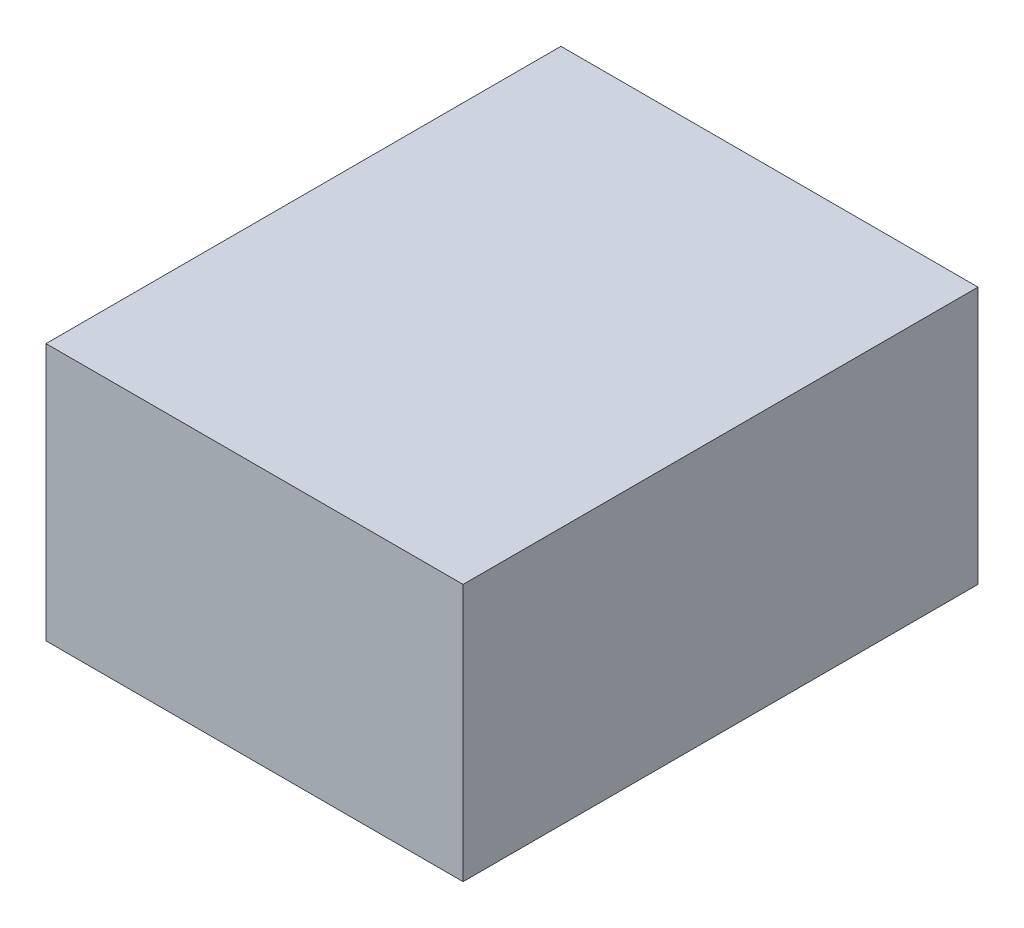
ISO-10303-21;
HEADER;
FILE_DESCRIPTION(('STEP AP214'),'2;1');
FILE_NAME('part.step','',(''),(''),'','','');
FILE_SCHEMA(('AUTOMOTIVE_DESIGN { 1 0 10303 214 1 1 1 1 }'));
ENDSEC;
DATA;
#1=APPLICATION_CONTEXT('core data for automotive mechanical design processes');
#2=APPLICATION_PROTOCOL_DEFINITION('international standard','automotive_design',2000,#1);
#3=PRODUCT_CONTEXT('',#1,'mechanical');
#4=PRODUCT('Part','Part','',(#3));
#5=PRODUCT_RELATED_PRODUCT_CATEGORY('part','',(#4));
#6=PRODUCT_DEFINITION_FORMATION('','',#4);
#7=PRODUCT_DEFINITION_CONTEXT('part definition',#1,'design');
#8=PRODUCT_DEFINITION('design','',#6,#7);
#9=PRODUCT_DEFINITION_SHAPE('','',#8);
#10=(LENGTH_UNIT() NAMED_UNIT(*) SI_UNIT(.MILLI.,.METRE.));
#11=(NAMED_UNIT(*) PLANE_ANGLE_UNIT() SI_UNIT($,.RADIAN.));
#12=(NAMED_UNIT(*) SI_UNIT($,.STERADIAN.) SOLID_ANGLE_UNIT());
#13=UNCERTAINTY_MEASURE_WITH_UNIT(LENGTH_MEASURE(1.E-05),#10,'distance_accuracy_value','');
#14=(GEOMETRIC_REPRESENTATION_CONTEXT(3) GLOBAL_UNCERTAINTY_ASSIGNED_CONTEXT((#13)) GLOBAL_UNIT_ASSIGNED_CONTEXT((#10,
#11,#12)) REPRESENTATION_CONTEXT('',''));
#15=CARTESIAN_POINT('',(0.,0.,0.));
#16=DIRECTION('',(0.,0.,1.));
#17=DIRECTION('',(1.,0.,0.));
#18=AXIS2_PLACEMENT_3D('',#15,#16,#17);
#19=CARTESIAN_POINT('',(0.,10.,0.));
#20=DIRECTION('',(1.,0.,0.));
#21=DIRECTION('',(0.,0.,-1.));
#22=AXIS2_PLACEMENT_3D('',#19,#20,#21);
#23=PLANE('',#22);
#24=DIRECTION('',(0.,0.,1.));
#25=VECTOR('',#24,1.);
#26=CARTESIAN_POINT('',(0.,0.,0.));
#27=LINE('',#26,#25);
#28=CARTESIAN_POINT('',(0.,0.,-20.));
#29=VERTEX_POINT('',#28);
#30=CARTESIAN_POINT('',(0.,0.,0.));
#31=VERTEX_POINT('',#30);
#32=EDGE_CURVE('E106',#29,#31,#27,.T.);
#33=ORIENTED_EDGE('',*,*,#32,.T.);
#34=DIRECTION('',(0.,-1.,0.));
#35=VECTOR('',#34,1.);
#36=CARTESIAN_POINT('',(0.,10.,0.));
#37=LINE('',#36,#35);
#38=CARTESIAN_POINT('',(0.,10.,0.));
#39=VERTEX_POINT('',#38);
#40=EDGE_CURVE('E11',#39,#31,#37,.T.);
#41=ORIENTED_EDGE('',*,*,#40,.F.);
#42=DIRECTION('',(0.,0.,1.));
#43=VECTOR('',#42,1.);
#44=CARTESIAN_POINT('',(0.,10.,0.));
#45=LINE('',#44,#43);
#46=CARTESIAN_POINT('',(0.,10.,-20.));
#47=VERTEX_POINT('',#46);
#48=EDGE_CURVE('E92',#47,#39,#45,.T.);
#49=ORIENTED_EDGE('',*,*,#48,.F.);
#50=DIRECTION('',(0.,-1.,0.));
#51=VECTOR('',#50,1.);
#52=CARTESIAN_POINT('',(0.,10.,-20.));
#53=LINE('',#52,#51);
#54=EDGE_CURVE('E105',#47,#29,#53,.T.);
#55=ORIENTED_EDGE('',*,*,#54,.T.);
#56=EDGE_LOOP('',(#33,#41,#49,#55));
#57=FACE_BOUND('',#56,.T.);
#58=ADVANCED_FACE('F43',(#57),#23,.F.);
#59=CARTESIAN_POINT('',(0.,10.,0.));
#60=DIRECTION('',(0.,0.,-1.));
#61=DIRECTION('',(-1.,0.,0.));
#62=AXIS2_PLACEMENT_3D('',#59,#60,#61);
#63=PLANE('',#62);
#64=DIRECTION('',(1.,0.,0.));
#65=VECTOR('',#64,1.);
#66=CARTESIAN_POINT('',(0.,0.,0.));
#67=LINE('',#66,#65);
#68=CARTESIAN_POINT('',(16.2,0.,0.));
#69=VERTEX_POINT('',#68);
#70=EDGE_CURVE('E97',#31,#69,#67,.T.);
#71=ORIENTED_EDGE('',*,*,#70,.T.);
#72=DIRECTION('',(0.,-1.,0.));
#73=VECTOR('',#72,1.);
#74=CARTESIAN_POINT('',(16.2,10.,0.));
#75=LINE('',#74,#73);
#76=CARTESIAN_POINT('',(16.2,10.,0.));
#77=VERTEX_POINT('',#76);
#78=EDGE_CURVE('E51',#77,#69,#75,.T.);
#79=ORIENTED_EDGE('',*,*,#78,.F.);
#80=DIRECTION('',(1.,0.,0.));
#81=VECTOR('',#80,1.);
#82=CARTESIAN_POINT('',(0.,10.,0.));
#83=LINE('',#82,#81);
#84=EDGE_CURVE('E87',#39,#77,#83,.T.);
#85=ORIENTED_EDGE('',*,*,#84,.F.);
#86=ORIENTED_EDGE('',*,*,#40,.T.);
#87=EDGE_LOOP('',(#71,#79,#85,#86));
#88=FACE_BOUND('',#87,.T.);
#89=ADVANCED_FACE('F100',(#88),#63,.F.);
#90=CARTESIAN_POINT('',(16.2,10.,0.));
#91=DIRECTION('',(-1.,0.,0.));
#92=DIRECTION('',(0.,0.,1.));
#93=AXIS2_PLACEMENT_3D('',#90,#91,#92);
#94=PLANE('',#93);
#95=DIRECTION('',(0.,0.,-1.));
#96=VECTOR('',#95,1.);
#97=CARTESIAN_POINT('',(16.2,0.,0.));
#98=LINE('',#97,#96);
#99=CARTESIAN_POINT('',(16.2,0.,-20.));
#100=VERTEX_POINT('',#99);
#101=EDGE_CURVE('E78',#69,#100,#98,.T.);
#102=ORIENTED_EDGE('',*,*,#101,.T.);
#103=DIRECTION('',(0.,-1.,0.));
#104=VECTOR('',#103,1.);
#105=CARTESIAN_POINT('',(16.2,10.,-20.));
#106=LINE('',#105,#104);
#107=CARTESIAN_POINT('',(16.2,10.,-20.));
#108=VERTEX_POINT('',#107);
#109=EDGE_CURVE('E98',#108,#100,#106,.T.);
#110=ORIENTED_EDGE('',*,*,#109,.F.);
#111=DIRECTION('',(0.,0.,-1.));
#112=VECTOR('',#111,1.);
#113=CARTESIAN_POINT('',(16.2,10.,0.));
#114=LINE('',#113,#112);
#115=EDGE_CURVE('E95',#77,#108,#114,.T.);
#116=ORIENTED_EDGE('',*,*,#115,.F.);
#117=ORIENTED_EDGE('',*,*,#78,.T.);
#118=EDGE_LOOP('',(#102,#110,#116,#117));
#119=FACE_BOUND('',#118,.T.);
#120=ADVANCED_FACE('F99',(#119),#94,.F.);
#121=CARTESIAN_POINT('',(0.,10.,-20.));
#122=DIRECTION('',(0.,0.,1.));
#123=DIRECTION('',(1.,0.,0.));
#124=AXIS2_PLACEMENT_3D('',#121,#122,#123);
#125=PLANE('',#124);
#126=DIRECTION('',(-1.,0.,0.));
#127=VECTOR('',#126,1.);
#128=CARTESIAN_POINT('',(0.,0.,-20.));
#129=LINE('',#128,#127);
#130=EDGE_CURVE('E85',#100,#29,#129,.T.);
#131=ORIENTED_EDGE('',*,*,#130,.T.);
#132=ORIENTED_EDGE('',*,*,#54,.F.);
#133=DIRECTION('',(-1.,0.,0.));
#134=VECTOR('',#133,1.);
#135=CARTESIAN_POINT('',(0.,10.,-20.));
#136=LINE('',#135,#134);
#137=EDGE_CURVE('E56',#108,#47,#136,.T.);
#138=ORIENTED_EDGE('',*,*,#137,.F.);
#139=ORIENTED_EDGE('',*,*,#109,.T.);
#140=EDGE_LOOP('',(#131,#132,#138,#139));
#141=FACE_BOUND('',#140,.T.);
#142=ADVANCED_FACE('F111',(#141),#125,.F.);
#143=CARTESIAN_POINT('',(0.,10.,0.));
#144=DIRECTION('',(0.,-1.,0.));
#145=DIRECTION('',(0.,0.,-1.));
#146=AXIS2_PLACEMENT_3D('',#143,#144,#145);
#147=PLANE('',#146);
#148=ORIENTED_EDGE('',*,*,#48,.T.);
#149=ORIENTED_EDGE('',*,*,#84,.T.);
#150=ORIENTED_EDGE('',*,*,#115,.T.);
#151=ORIENTED_EDGE('',*,*,#137,.T.);
#152=EDGE_LOOP('',(#148,#149,#150,#151));
#153=FACE_BOUND('',#152,.T.);
#154=ADVANCED_FACE('F89',(#153),#147,.F.);
#155=CARTESIAN_POINT('',(0.,0.,0.));
#156=DIRECTION('',(0.,-1.,0.));
#157=DIRECTION('',(0.,0.,-1.));
#158=AXIS2_PLACEMENT_3D('',#155,#156,#157);
#159=PLANE('',#158);
#160=ORIENTED_EDGE('',*,*,#32,.F.);
#161=ORIENTED_EDGE('',*,*,#130,.F.);
#162=ORIENTED_EDGE('',*,*,#101,.F.);
#163=ORIENTED_EDGE('',*,*,#70,.F.);
#164=EDGE_LOOP('',(#160,#161,#162,#163));
#165=FACE_BOUND('',#164,.T.);
#166=ADVANCED_FACE('F116',(#165),#159,.T.);
#167=CLOSED_SHELL('',(#58,#89,#120,#142,#154,#166));
#168=MANIFOLD_SOLID_BREP('B2',#167);
#169=ADVANCED_BREP_SHAPE_REPRESENTATION('',(#18,#168),#14);
#170=SHAPE_DEFINITION_REPRESENTATION(#9,#169);
ENDSEC;
END-ISO-10303-21;
